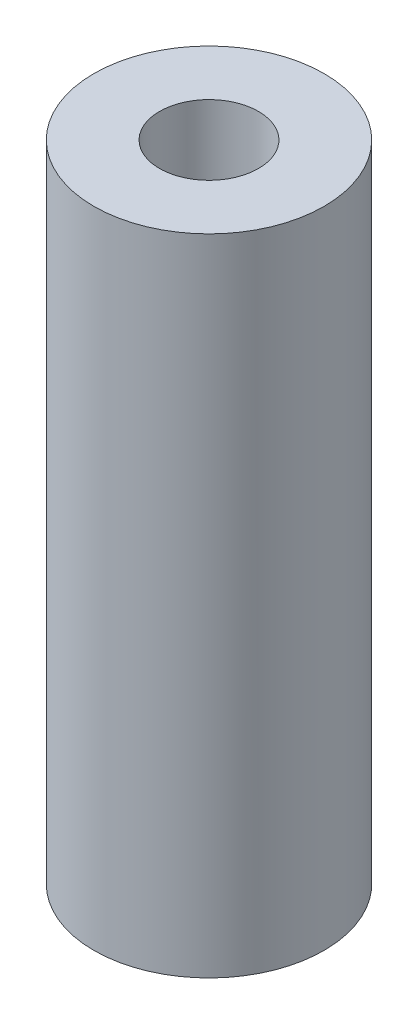
ISO-10303-21;
HEADER;
FILE_DESCRIPTION(('STEP AP214'),'2;1');
FILE_NAME('part.step','',(''),(''),'','','');
FILE_SCHEMA(('AUTOMOTIVE_DESIGN { 1 0 10303 214 1 1 1 1 }'));
ENDSEC;
DATA;
#1=APPLICATION_CONTEXT('core data for automotive mechanical design processes');
#2=APPLICATION_PROTOCOL_DEFINITION('international standard','automotive_design',2000,#1);
#3=PRODUCT_CONTEXT('',#1,'mechanical');
#4=PRODUCT('Part','Part','',(#3));
#5=PRODUCT_RELATED_PRODUCT_CATEGORY('part','',(#4));
#6=PRODUCT_DEFINITION_FORMATION('','',#4);
#7=PRODUCT_DEFINITION_CONTEXT('part definition',#1,'design');
#8=PRODUCT_DEFINITION('design','',#6,#7);
#9=PRODUCT_DEFINITION_SHAPE('','',#8);
#10=(LENGTH_UNIT() NAMED_UNIT(*) SI_UNIT(.MILLI.,.METRE.));
#11=(NAMED_UNIT(*) PLANE_ANGLE_UNIT() SI_UNIT($,.RADIAN.));
#12=(NAMED_UNIT(*) SI_UNIT($,.STERADIAN.) SOLID_ANGLE_UNIT());
#13=UNCERTAINTY_MEASURE_WITH_UNIT(LENGTH_MEASURE(1.E-05),#10,'distance_accuracy_value','');
#14=(GEOMETRIC_REPRESENTATION_CONTEXT(3) GLOBAL_UNCERTAINTY_ASSIGNED_CONTEXT((#13)) GLOBAL_UNIT_ASSIGNED_CONTEXT((#10,
#11,#12)) REPRESENTATION_CONTEXT('',''));
#15=CARTESIAN_POINT('',(0.,0.,0.));
#16=DIRECTION('',(0.,0.,1.));
#17=DIRECTION('',(1.,0.,0.));
#18=AXIS2_PLACEMENT_3D('',#15,#16,#17);
#19=CARTESIAN_POINT('',(-88.9,-28.142135623731,0.));
#20=DIRECTION('',(0.,1.,0.));
#21=DIRECTION('',(0.,0.,1.));
#22=AXIS2_PLACEMENT_3D('',#19,#20,#21);
#23=CYLINDRICAL_SURFACE('',#22,5.);
#24=CARTESIAN_POINT('',(-88.9,-14.,0.));
#25=DIRECTION('',(0.,1.,0.));
#26=DIRECTION('',(0.,0.,1.));
#27=AXIS2_PLACEMENT_3D('',#24,#25,#26);
#28=CIRCLE('',#27,5.);
#29=CARTESIAN_POINT('',(-88.9,-14.,5.00000000000004));
#30=VERTEX_POINT('',#29);
#31=EDGE_CURVE('E10',#30,#30,#28,.F.);
#32=ORIENTED_EDGE('',*,*,#31,.F.);
#33=EDGE_LOOP('',(#32));
#34=FACE_BOUND('',#33,.T.);
#35=CARTESIAN_POINT('',(-88.9,14.,0.));
#36=DIRECTION('',(0.,-1.,0.));
#37=DIRECTION('',(0.,0.,-1.));
#38=AXIS2_PLACEMENT_3D('',#35,#36,#37);
#39=CIRCLE('',#38,5.);
#40=CARTESIAN_POINT('',(-88.9,14.,-4.99999999999997));
#41=VERTEX_POINT('',#40);
#42=EDGE_CURVE('E44',#41,#41,#39,.T.);
#43=ORIENTED_EDGE('',*,*,#42,.T.);
#44=EDGE_LOOP('',(#43));
#45=FACE_BOUND('',#44,.T.);
#46=ADVANCED_FACE('F37',(#34,#45),#23,.T.);
#47=CARTESIAN_POINT('',(0.,-14.,0.));
#48=DIRECTION('',(0.,1.,0.));
#49=DIRECTION('',(0.,0.,1.));
#50=AXIS2_PLACEMENT_3D('',#47,#48,#49);
#51=PLANE('',#50);
#52=CARTESIAN_POINT('',(-88.9,-14.,0.));
#53=DIRECTION('',(0.,-1.,0.));
#54=DIRECTION('',(0.,0.,-1.));
#55=AXIS2_PLACEMENT_3D('',#52,#53,#54);
#56=CIRCLE('',#55,2.15);
#57=CARTESIAN_POINT('',(-88.9,-14.,-2.14999999999996));
#58=VERTEX_POINT('',#57);
#59=EDGE_CURVE('E50',#58,#58,#56,.T.);
#60=ORIENTED_EDGE('',*,*,#59,.F.);
#61=EDGE_LOOP('',(#60));
#62=FACE_BOUND('',#61,.T.);
#63=ORIENTED_EDGE('',*,*,#31,.T.);
#64=EDGE_LOOP('',(#63));
#65=FACE_BOUND('',#64,.T.);
#66=ADVANCED_FACE('F67',(#62,#65),#51,.F.);
#67=CARTESIAN_POINT('',(0.,14.,0.));
#68=DIRECTION('',(0.,-1.,0.));
#69=DIRECTION('',(0.,0.,1.));
#70=AXIS2_PLACEMENT_3D('',#67,#68,#69);
#71=PLANE('',#70);
#72=CARTESIAN_POINT('',(-88.9,14.,0.));
#73=DIRECTION('',(0.,-1.,0.));
#74=DIRECTION('',(0.,0.,-1.));
#75=AXIS2_PLACEMENT_3D('',#72,#73,#74);
#76=CIRCLE('',#75,2.15);
#77=CARTESIAN_POINT('',(-88.9,14.,-2.14999999999996));
#78=VERTEX_POINT('',#77);
#79=EDGE_CURVE('E40',#78,#78,#76,.T.);
#80=ORIENTED_EDGE('',*,*,#79,.T.);
#81=EDGE_LOOP('',(#80));
#82=FACE_BOUND('',#81,.T.);
#83=ORIENTED_EDGE('',*,*,#42,.F.);
#84=EDGE_LOOP('',(#83));
#85=FACE_BOUND('',#84,.T.);
#86=ADVANCED_FACE('F57',(#82,#85),#71,.F.);
#87=CARTESIAN_POINT('',(-88.9,20.35,0.));
#88=DIRECTION('',(0.,-1.,0.));
#89=DIRECTION('',(0.,0.,-1.));
#90=AXIS2_PLACEMENT_3D('',#87,#88,#89);
#91=CYLINDRICAL_SURFACE('',#90,2.15);
#92=ORIENTED_EDGE('',*,*,#59,.T.);
#93=EDGE_LOOP('',(#92));
#94=FACE_BOUND('',#93,.T.);
#95=ORIENTED_EDGE('',*,*,#79,.F.);
#96=EDGE_LOOP('',(#95));
#97=FACE_BOUND('',#96,.T.);
#98=ADVANCED_FACE('F60',(#94,#97),#91,.F.);
#99=CLOSED_SHELL('',(#46,#66,#86,#98));
#100=MANIFOLD_SOLID_BREP('B2',#99);
#101=ADVANCED_BREP_SHAPE_REPRESENTATION('',(#18,#100),#14);
#102=SHAPE_DEFINITION_REPRESENTATION(#9,#101);
ENDSEC;
END-ISO-10303-21;
